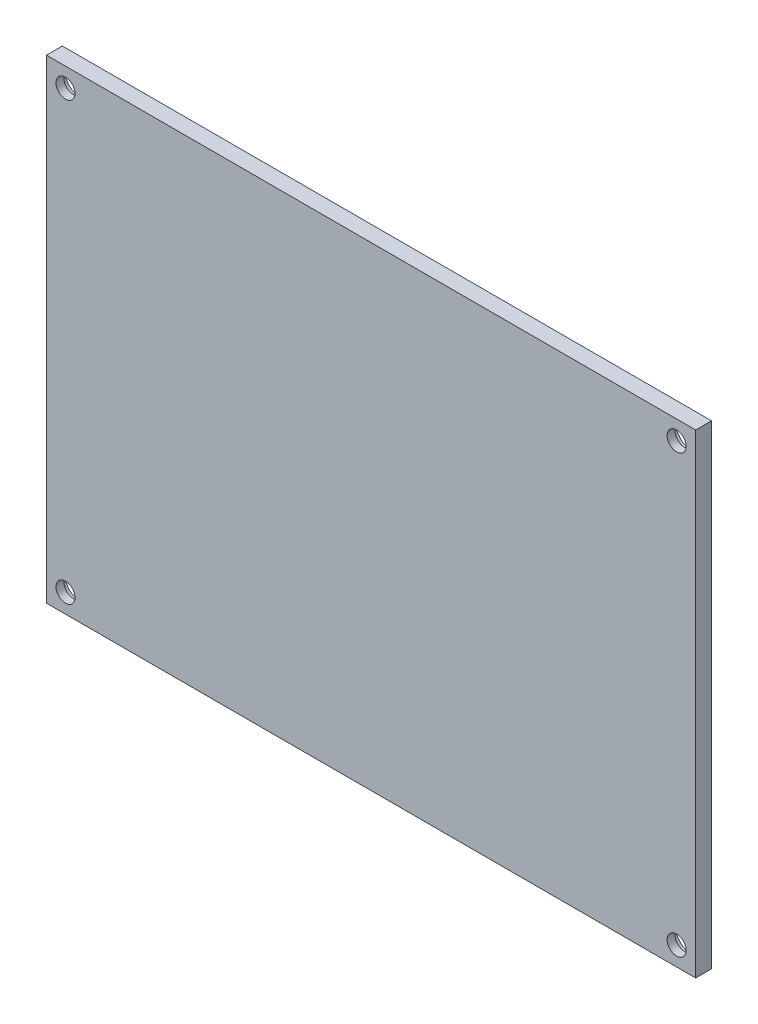
ISO-10303-21;
HEADER;
FILE_DESCRIPTION(('STEP AP214'),'2;1');
FILE_NAME('part.step','',(''),(''),'','','');
FILE_SCHEMA(('AUTOMOTIVE_DESIGN { 1 0 10303 214 1 1 1 1 }'));
ENDSEC;
DATA;
#1=APPLICATION_CONTEXT('core data for automotive mechanical design processes');
#2=APPLICATION_PROTOCOL_DEFINITION('international standard','automotive_design',2000,#1);
#3=PRODUCT_CONTEXT('',#1,'mechanical');
#4=PRODUCT('Part','Part','',(#3));
#5=PRODUCT_RELATED_PRODUCT_CATEGORY('part','',(#4));
#6=PRODUCT_DEFINITION_FORMATION('','',#4);
#7=PRODUCT_DEFINITION_CONTEXT('part definition',#1,'design');
#8=PRODUCT_DEFINITION('design','',#6,#7);
#9=PRODUCT_DEFINITION_SHAPE('','',#8);
#10=(LENGTH_UNIT() NAMED_UNIT(*) SI_UNIT(.MILLI.,.METRE.));
#11=(NAMED_UNIT(*) PLANE_ANGLE_UNIT() SI_UNIT($,.RADIAN.));
#12=(NAMED_UNIT(*) SI_UNIT($,.STERADIAN.) SOLID_ANGLE_UNIT());
#13=UNCERTAINTY_MEASURE_WITH_UNIT(LENGTH_MEASURE(1.E-05),#10,'distance_accuracy_value','');
#14=(GEOMETRIC_REPRESENTATION_CONTEXT(3) GLOBAL_UNCERTAINTY_ASSIGNED_CONTEXT((#13)) GLOBAL_UNIT_ASSIGNED_CONTEXT((#10,
#11,#12)) REPRESENTATION_CONTEXT('',''));
#15=CARTESIAN_POINT('',(0.,0.,0.));
#16=DIRECTION('',(0.,0.,1.));
#17=DIRECTION('',(1.,0.,0.));
#18=AXIS2_PLACEMENT_3D('',#15,#16,#17);
#19=CARTESIAN_POINT('',(54.6911532185415,-26.7638727859662,2.));
#20=DIRECTION('',(0.,1.,0.));
#21=DIRECTION('',(0.,0.,1.));
#22=AXIS2_PLACEMENT_3D('',#19,#20,#21);
#23=PLANE('',#22);
#24=DIRECTION('',(1.,0.,0.));
#25=VECTOR('',#24,1.);
#26=CARTESIAN_POINT('',(54.6911532185415,-26.7638727859662,0.));
#27=LINE('',#26,#25);
#28=CARTESIAN_POINT('',(54.6911532185415,-26.7638727859662,0.));
#29=VERTEX_POINT('',#28);
#30=CARTESIAN_POINT('',(136.491153218541,-26.7638727859662,0.));
#31=VERTEX_POINT('',#30);
#32=EDGE_CURVE('E99',#29,#31,#27,.T.);
#33=ORIENTED_EDGE('',*,*,#32,.T.);
#34=DIRECTION('',(0.,0.,-1.));
#35=VECTOR('',#34,1.);
#36=CARTESIAN_POINT('',(136.491153218541,-26.7638727859662,2.));
#37=LINE('',#36,#35);
#38=CARTESIAN_POINT('',(136.491153218541,-26.7638727859662,2.));
#39=VERTEX_POINT('',#38);
#40=EDGE_CURVE('E11',#39,#31,#37,.T.);
#41=ORIENTED_EDGE('',*,*,#40,.F.);
#42=DIRECTION('',(1.,0.,0.));
#43=VECTOR('',#42,1.);
#44=CARTESIAN_POINT('',(54.6911532185415,-26.7638727859662,2.));
#45=LINE('',#44,#43);
#46=CARTESIAN_POINT('',(54.6911532185415,-26.7638727859662,2.));
#47=VERTEX_POINT('',#46);
#48=EDGE_CURVE('E86',#47,#39,#45,.T.);
#49=ORIENTED_EDGE('',*,*,#48,.F.);
#50=DIRECTION('',(0.,0.,-1.));
#51=VECTOR('',#50,1.);
#52=CARTESIAN_POINT('',(54.6911532185415,-26.7638727859662,2.));
#53=LINE('',#52,#51);
#54=EDGE_CURVE('E95',#47,#29,#53,.T.);
#55=ORIENTED_EDGE('',*,*,#54,.T.);
#56=EDGE_LOOP('',(#33,#41,#49,#55));
#57=FACE_BOUND('',#56,.T.);
#58=ADVANCED_FACE('F33',(#57),#23,.F.);
#59=CARTESIAN_POINT('',(136.491153218541,-26.7638727859662,2.));
#60=DIRECTION('',(-1.,0.,0.));
#61=DIRECTION('',(0.,0.,1.));
#62=AXIS2_PLACEMENT_3D('',#59,#60,#61);
#63=PLANE('',#62);
#64=DIRECTION('',(0.,1.,0.));
#65=VECTOR('',#64,1.);
#66=CARTESIAN_POINT('',(136.491153218541,-26.7638727859662,0.));
#67=LINE('',#66,#65);
#68=CARTESIAN_POINT('',(136.491153218541,33.0361272140338,0.));
#69=VERTEX_POINT('',#68);
#70=EDGE_CURVE('E90',#31,#69,#67,.T.);
#71=ORIENTED_EDGE('',*,*,#70,.T.);
#72=DIRECTION('',(0.,0.,-1.));
#73=VECTOR('',#72,1.);
#74=CARTESIAN_POINT('',(136.491153218541,33.0361272140338,2.));
#75=LINE('',#74,#73);
#76=CARTESIAN_POINT('',(136.491153218541,33.0361272140338,2.));
#77=VERTEX_POINT('',#76);
#78=EDGE_CURVE('E42',#77,#69,#75,.T.);
#79=ORIENTED_EDGE('',*,*,#78,.F.);
#80=DIRECTION('',(0.,1.,0.));
#81=VECTOR('',#80,1.);
#82=CARTESIAN_POINT('',(136.491153218541,-26.7638727859662,2.));
#83=LINE('',#82,#81);
#84=EDGE_CURVE('E81',#39,#77,#83,.T.);
#85=ORIENTED_EDGE('',*,*,#84,.F.);
#86=ORIENTED_EDGE('',*,*,#40,.T.);
#87=EDGE_LOOP('',(#71,#79,#85,#86));
#88=FACE_BOUND('',#87,.T.);
#89=ADVANCED_FACE('F89',(#88),#63,.F.);
#90=CARTESIAN_POINT('',(136.491153218541,33.0361272140338,2.));
#91=DIRECTION('',(0.,-1.,0.));
#92=DIRECTION('',(0.,0.,-1.));
#93=AXIS2_PLACEMENT_3D('',#90,#91,#92);
#94=PLANE('',#93);
#95=DIRECTION('',(-1.,0.,0.));
#96=VECTOR('',#95,1.);
#97=CARTESIAN_POINT('',(136.491153218541,33.0361272140338,0.));
#98=LINE('',#97,#96);
#99=CARTESIAN_POINT('',(54.6911532185415,33.0361272140338,0.));
#100=VERTEX_POINT('',#99);
#101=EDGE_CURVE('E68',#69,#100,#98,.T.);
#102=ORIENTED_EDGE('',*,*,#101,.T.);
#103=DIRECTION('',(0.,0.,-1.));
#104=VECTOR('',#103,1.);
#105=CARTESIAN_POINT('',(54.6911532185415,33.0361272140338,2.));
#106=LINE('',#105,#104);
#107=CARTESIAN_POINT('',(54.6911532185415,33.0361272140338,2.));
#108=VERTEX_POINT('',#107);
#109=EDGE_CURVE('E91',#108,#100,#106,.T.);
#110=ORIENTED_EDGE('',*,*,#109,.F.);
#111=DIRECTION('',(-1.,0.,0.));
#112=VECTOR('',#111,1.);
#113=CARTESIAN_POINT('',(136.491153218541,33.0361272140338,2.));
#114=LINE('',#113,#112);
#115=EDGE_CURVE('E84',#77,#108,#114,.T.);
#116=ORIENTED_EDGE('',*,*,#115,.F.);
#117=ORIENTED_EDGE('',*,*,#78,.T.);
#118=EDGE_LOOP('',(#102,#110,#116,#117));
#119=FACE_BOUND('',#118,.T.);
#120=ADVANCED_FACE('F93',(#119),#94,.F.);
#121=CARTESIAN_POINT('',(54.6911532185415,33.0361272140338,2.));
#122=DIRECTION('',(1.,0.,0.));
#123=DIRECTION('',(0.,1.,0.));
#124=AXIS2_PLACEMENT_3D('',#121,#122,#123);
#125=PLANE('',#124);
#126=DIRECTION('',(0.,-1.,0.));
#127=VECTOR('',#126,1.);
#128=CARTESIAN_POINT('',(54.6911532185415,33.0361272140338,0.));
#129=LINE('',#128,#127);
#130=EDGE_CURVE('E74',#100,#29,#129,.T.);
#131=ORIENTED_EDGE('',*,*,#130,.T.);
#132=ORIENTED_EDGE('',*,*,#54,.F.);
#133=DIRECTION('',(0.,-1.,0.));
#134=VECTOR('',#133,1.);
#135=CARTESIAN_POINT('',(54.6911532185415,33.0361272140338,2.));
#136=LINE('',#135,#134);
#137=EDGE_CURVE('E51',#108,#47,#136,.T.);
#138=ORIENTED_EDGE('',*,*,#137,.F.);
#139=ORIENTED_EDGE('',*,*,#109,.T.);
#140=EDGE_LOOP('',(#131,#132,#138,#139));
#141=FACE_BOUND('',#140,.T.);
#142=ADVANCED_FACE('F168',(#141),#125,.F.);
#143=CARTESIAN_POINT('',(0.,0.,2.));
#144=DIRECTION('',(0.,0.,1.));
#145=DIRECTION('',(1.,0.,0.));
#146=AXIS2_PLACEMENT_3D('',#143,#144,#145);
#147=PLANE('',#146);
#148=CARTESIAN_POINT('',(57.0911532185415,30.6361272140338,2.));
#149=DIRECTION('',(0.,0.,1.));
#150=DIRECTION('',(1.,0.,0.));
#151=AXIS2_PLACEMENT_3D('',#148,#149,#150);
#152=CIRCLE('',#151,1.2);
#153=CARTESIAN_POINT('',(58.2911532185415,30.6361272140338,2.));
#154=VERTEX_POINT('',#153);
#155=EDGE_CURVE('E36',#154,#154,#152,.T.);
#156=ORIENTED_EDGE('',*,*,#155,.F.);
#157=EDGE_LOOP('',(#156));
#158=FACE_BOUND('',#157,.T.);
#159=CARTESIAN_POINT('',(134.091153218541,30.6361272140338,2.));
#160=DIRECTION('',(0.,0.,1.));
#161=DIRECTION('',(1.,0.,0.));
#162=AXIS2_PLACEMENT_3D('',#159,#160,#161);
#163=CIRCLE('',#162,1.20000000000001);
#164=CARTESIAN_POINT('',(135.291153218541,30.6361272140338,2.));
#165=VERTEX_POINT('',#164);
#166=EDGE_CURVE('E115',#165,#165,#163,.T.);
#167=ORIENTED_EDGE('',*,*,#166,.F.);
#168=EDGE_LOOP('',(#167));
#169=FACE_BOUND('',#168,.T.);
#170=CARTESIAN_POINT('',(57.0911532185415,-24.3638727859662,2.));
#171=DIRECTION('',(0.,0.,1.));
#172=DIRECTION('',(1.,0.,0.));
#173=AXIS2_PLACEMENT_3D('',#170,#171,#172);
#174=CIRCLE('',#173,1.2);
#175=CARTESIAN_POINT('',(58.2911532185415,-24.3638727859662,2.));
#176=VERTEX_POINT('',#175);
#177=EDGE_CURVE('E111',#176,#176,#174,.T.);
#178=ORIENTED_EDGE('',*,*,#177,.F.);
#179=EDGE_LOOP('',(#178));
#180=FACE_BOUND('',#179,.T.);
#181=CARTESIAN_POINT('',(134.091153218541,-24.3638727859662,2.));
#182=DIRECTION('',(0.,0.,1.));
#183=DIRECTION('',(1.,0.,0.));
#184=AXIS2_PLACEMENT_3D('',#181,#182,#183);
#185=CIRCLE('',#184,1.20000000000001);
#186=CARTESIAN_POINT('',(135.291153218541,-24.3638727859662,2.));
#187=VERTEX_POINT('',#186);
#188=EDGE_CURVE('E102',#187,#187,#185,.T.);
#189=ORIENTED_EDGE('',*,*,#188,.F.);
#190=EDGE_LOOP('',(#189));
#191=FACE_BOUND('',#190,.T.);
#192=ORIENTED_EDGE('',*,*,#48,.T.);
#193=ORIENTED_EDGE('',*,*,#84,.T.);
#194=ORIENTED_EDGE('',*,*,#115,.T.);
#195=ORIENTED_EDGE('',*,*,#137,.T.);
#196=EDGE_LOOP('',(#192,#193,#194,#195));
#197=FACE_BOUND('',#196,.T.);
#198=ADVANCED_FACE('F82',(#158,#169,#180,#191,#197),#147,.T.);
#199=CARTESIAN_POINT('',(0.,0.,0.));
#200=DIRECTION('',(0.,0.,1.));
#201=DIRECTION('',(1.,0.,0.));
#202=AXIS2_PLACEMENT_3D('',#199,#200,#201);
#203=PLANE('',#202);
#204=CARTESIAN_POINT('',(57.0911532185415,30.6361272140338,0.));
#205=DIRECTION('',(0.,0.,-1.));
#206=DIRECTION('',(-1.,0.,0.));
#207=AXIS2_PLACEMENT_3D('',#204,#205,#206);
#208=CIRCLE('',#207,2.125);
#209=CARTESIAN_POINT('',(54.9661532185415,30.6361272140338,0.));
#210=VERTEX_POINT('',#209);
#211=EDGE_CURVE('E323',#210,#210,#208,.T.);
#212=ORIENTED_EDGE('',*,*,#211,.F.);
#213=EDGE_LOOP('',(#212));
#214=FACE_BOUND('',#213,.T.);
#215=CARTESIAN_POINT('',(134.091153218541,30.6361272140338,0.));
#216=DIRECTION('',(0.,0.,-1.));
#217=DIRECTION('',(-1.,0.,0.));
#218=AXIS2_PLACEMENT_3D('',#215,#216,#217);
#219=CIRCLE('',#218,2.12499999999999);
#220=CARTESIAN_POINT('',(131.966153218541,30.6361272140338,0.));
#221=VERTEX_POINT('',#220);
#222=EDGE_CURVE('E130',#221,#221,#219,.T.);
#223=ORIENTED_EDGE('',*,*,#222,.F.);
#224=EDGE_LOOP('',(#223));
#225=FACE_BOUND('',#224,.T.);
#226=CARTESIAN_POINT('',(57.0911532185415,-24.3638727859662,0.));
#227=DIRECTION('',(0.,0.,-1.));
#228=DIRECTION('',(-1.,0.,0.));
#229=AXIS2_PLACEMENT_3D('',#226,#227,#228);
#230=CIRCLE('',#229,2.125);
#231=CARTESIAN_POINT('',(54.9661532185415,-24.3638727859662,0.));
#232=VERTEX_POINT('',#231);
#233=EDGE_CURVE('E117',#232,#232,#230,.T.);
#234=ORIENTED_EDGE('',*,*,#233,.F.);
#235=EDGE_LOOP('',(#234));
#236=FACE_BOUND('',#235,.T.);
#237=CARTESIAN_POINT('',(134.091153218541,-24.3638727859662,0.));
#238=DIRECTION('',(0.,0.,-1.));
#239=DIRECTION('',(-1.,0.,0.));
#240=AXIS2_PLACEMENT_3D('',#237,#238,#239);
#241=CIRCLE('',#240,2.12499999999999);
#242=CARTESIAN_POINT('',(131.966153218541,-24.3638727859662,0.));
#243=VERTEX_POINT('',#242);
#244=EDGE_CURVE('E113',#243,#243,#241,.T.);
#245=ORIENTED_EDGE('',*,*,#244,.F.);
#246=EDGE_LOOP('',(#245));
#247=FACE_BOUND('',#246,.T.);
#248=ORIENTED_EDGE('',*,*,#32,.F.);
#249=ORIENTED_EDGE('',*,*,#130,.F.);
#250=ORIENTED_EDGE('',*,*,#101,.F.);
#251=ORIENTED_EDGE('',*,*,#70,.F.);
#252=EDGE_LOOP('',(#248,#249,#250,#251));
#253=FACE_BOUND('',#252,.T.);
#254=ADVANCED_FACE('F161',(#214,#225,#236,#247,#253),#203,.F.);
#255=CARTESIAN_POINT('',(134.091153218541,-24.3638727859662,0.));
#256=DIRECTION('',(0.,0.,-1.));
#257=DIRECTION('',(-1.,0.,0.));
#258=AXIS2_PLACEMENT_3D('',#255,#256,#257);
#259=CYLINDRICAL_SURFACE('',#258,1.20000000000001);
#260=ORIENTED_EDGE('',*,*,#188,.T.);
#261=EDGE_LOOP('',(#260));
#262=FACE_BOUND('',#261,.T.);
#263=CARTESIAN_POINT('',(134.091153218541,-24.3638727859662,1.));
#264=DIRECTION('',(0.,0.,-1.));
#265=DIRECTION('',(-1.,0.,0.));
#266=AXIS2_PLACEMENT_3D('',#263,#264,#265);
#267=CIRCLE('',#266,1.20000000000001);
#268=CARTESIAN_POINT('',(132.891153218541,-24.3638727859662,1.));
#269=VERTEX_POINT('',#268);
#270=EDGE_CURVE('E110',#269,#269,#267,.T.);
#271=ORIENTED_EDGE('',*,*,#270,.T.);
#272=EDGE_LOOP('',(#271));
#273=FACE_BOUND('',#272,.T.);
#274=ADVANCED_FACE('F146',(#262,#273),#259,.F.);
#275=CARTESIAN_POINT('',(135.291153218541,-24.3638727859662,1.));
#276=DIRECTION('',(0.,0.,1.));
#277=DIRECTION('',(1.,0.,0.));
#278=AXIS2_PLACEMENT_3D('',#275,#276,#277);
#279=PLANE('',#278);
#280=ORIENTED_EDGE('',*,*,#270,.F.);
#281=EDGE_LOOP('',(#280));
#282=FACE_BOUND('',#281,.T.);
#283=CARTESIAN_POINT('',(134.091153218541,-24.3638727859662,1.));
#284=DIRECTION('',(0.,0.,-1.));
#285=DIRECTION('',(-1.,0.,0.));
#286=AXIS2_PLACEMENT_3D('',#283,#284,#285);
#287=CIRCLE('',#286,2.12499999999999);
#288=CARTESIAN_POINT('',(131.966153218541,-24.3638727859662,1.));
#289=VERTEX_POINT('',#288);
#290=EDGE_CURVE('E140',#289,#289,#287,.T.);
#291=ORIENTED_EDGE('',*,*,#290,.T.);
#292=EDGE_LOOP('',(#291));
#293=FACE_BOUND('',#292,.T.);
#294=ADVANCED_FACE('F148',(#282,#293),#279,.F.);
#295=CARTESIAN_POINT('',(134.091153218541,-24.3638727859662,0.));
#296=DIRECTION('',(0.,0.,-1.));
#297=DIRECTION('',(-1.,0.,0.));
#298=AXIS2_PLACEMENT_3D('',#295,#296,#297);
#299=CYLINDRICAL_SURFACE('',#298,2.12499999999999);
#300=ORIENTED_EDGE('',*,*,#290,.F.);
#301=EDGE_LOOP('',(#300));
#302=FACE_BOUND('',#301,.T.);
#303=ORIENTED_EDGE('',*,*,#244,.T.);
#304=EDGE_LOOP('',(#303));
#305=FACE_BOUND('',#304,.T.);
#306=ADVANCED_FACE('F151',(#302,#305),#299,.F.);
#307=CARTESIAN_POINT('',(57.0911532185415,-24.3638727859662,0.));
#308=DIRECTION('',(0.,0.,-1.));
#309=DIRECTION('',(-1.,0.,0.));
#310=AXIS2_PLACEMENT_3D('',#307,#308,#309);
#311=CYLINDRICAL_SURFACE('',#310,1.2);
#312=ORIENTED_EDGE('',*,*,#177,.T.);
#313=EDGE_LOOP('',(#312));
#314=FACE_BOUND('',#313,.T.);
#315=CARTESIAN_POINT('',(57.0911532185415,-24.3638727859662,1.));
#316=DIRECTION('',(0.,0.,-1.));
#317=DIRECTION('',(-1.,0.,0.));
#318=AXIS2_PLACEMENT_3D('',#315,#316,#317);
#319=CIRCLE('',#318,1.2);
#320=CARTESIAN_POINT('',(55.8911532185415,-24.3638727859662,1.));
#321=VERTEX_POINT('',#320);
#322=EDGE_CURVE('E114',#321,#321,#319,.T.);
#323=ORIENTED_EDGE('',*,*,#322,.T.);
#324=EDGE_LOOP('',(#323));
#325=FACE_BOUND('',#324,.T.);
#326=ADVANCED_FACE('F157',(#314,#325),#311,.F.);
#327=CARTESIAN_POINT('',(58.2911532185415,-24.3638727859662,1.));
#328=DIRECTION('',(0.,0.,1.));
#329=DIRECTION('',(1.,0.,0.));
#330=AXIS2_PLACEMENT_3D('',#327,#328,#329);
#331=PLANE('',#330);
#332=ORIENTED_EDGE('',*,*,#322,.F.);
#333=EDGE_LOOP('',(#332));
#334=FACE_BOUND('',#333,.T.);
#335=CARTESIAN_POINT('',(57.0911532185415,-24.3638727859662,1.));
#336=DIRECTION('',(0.,0.,-1.));
#337=DIRECTION('',(-1.,0.,0.));
#338=AXIS2_PLACEMENT_3D('',#335,#336,#337);
#339=CIRCLE('',#338,2.125);
#340=CARTESIAN_POINT('',(54.9661532185415,-24.3638727859662,1.));
#341=VERTEX_POINT('',#340);
#342=EDGE_CURVE('E122',#341,#341,#339,.T.);
#343=ORIENTED_EDGE('',*,*,#342,.T.);
#344=EDGE_LOOP('',(#343));
#345=FACE_BOUND('',#344,.T.);
#346=ADVANCED_FACE('F234',(#334,#345),#331,.F.);
#347=CARTESIAN_POINT('',(57.0911532185415,-24.3638727859662,0.));
#348=DIRECTION('',(0.,0.,-1.));
#349=DIRECTION('',(-1.,0.,0.));
#350=AXIS2_PLACEMENT_3D('',#347,#348,#349);
#351=CYLINDRICAL_SURFACE('',#350,2.125);
#352=ORIENTED_EDGE('',*,*,#342,.F.);
#353=EDGE_LOOP('',(#352));
#354=FACE_BOUND('',#353,.T.);
#355=ORIENTED_EDGE('',*,*,#233,.T.);
#356=EDGE_LOOP('',(#355));
#357=FACE_BOUND('',#356,.T.);
#358=ADVANCED_FACE('F244',(#354,#357),#351,.F.);
#359=CARTESIAN_POINT('',(134.091153218541,30.6361272140338,0.));
#360=DIRECTION('',(0.,0.,-1.));
#361=DIRECTION('',(-1.,0.,0.));
#362=AXIS2_PLACEMENT_3D('',#359,#360,#361);
#363=CYLINDRICAL_SURFACE('',#362,1.20000000000001);
#364=ORIENTED_EDGE('',*,*,#166,.T.);
#365=EDGE_LOOP('',(#364));
#366=FACE_BOUND('',#365,.T.);
#367=CARTESIAN_POINT('',(134.091153218541,30.6361272140338,1.));
#368=DIRECTION('',(0.,0.,-1.));
#369=DIRECTION('',(-1.,0.,0.));
#370=AXIS2_PLACEMENT_3D('',#367,#368,#369);
#371=CIRCLE('',#370,1.20000000000001);
#372=CARTESIAN_POINT('',(132.891153218541,30.6361272140338,1.));
#373=VERTEX_POINT('',#372);
#374=EDGE_CURVE('E118',#373,#373,#371,.T.);
#375=ORIENTED_EDGE('',*,*,#374,.T.);
#376=EDGE_LOOP('',(#375));
#377=FACE_BOUND('',#376,.T.);
#378=ADVANCED_FACE('F254',(#366,#377),#363,.F.);
#379=CARTESIAN_POINT('',(135.291153218541,30.6361272140338,1.));
#380=DIRECTION('',(0.,0.,1.));
#381=DIRECTION('',(1.,0.,0.));
#382=AXIS2_PLACEMENT_3D('',#379,#380,#381);
#383=PLANE('',#382);
#384=ORIENTED_EDGE('',*,*,#374,.F.);
#385=EDGE_LOOP('',(#384));
#386=FACE_BOUND('',#385,.T.);
#387=CARTESIAN_POINT('',(134.091153218541,30.6361272140338,1.));
#388=DIRECTION('',(0.,0.,-1.));
#389=DIRECTION('',(-1.,0.,0.));
#390=AXIS2_PLACEMENT_3D('',#387,#388,#389);
#391=CIRCLE('',#390,2.12499999999999);
#392=CARTESIAN_POINT('',(131.966153218541,30.6361272140338,1.));
#393=VERTEX_POINT('',#392);
#394=EDGE_CURVE('E125',#393,#393,#391,.T.);
#395=ORIENTED_EDGE('',*,*,#394,.T.);
#396=EDGE_LOOP('',(#395));
#397=FACE_BOUND('',#396,.T.);
#398=ADVANCED_FACE('F264',(#386,#397),#383,.F.);
#399=CARTESIAN_POINT('',(134.091153218541,30.6361272140338,0.));
#400=DIRECTION('',(0.,0.,-1.));
#401=DIRECTION('',(-1.,0.,0.));
#402=AXIS2_PLACEMENT_3D('',#399,#400,#401);
#403=CYLINDRICAL_SURFACE('',#402,2.12499999999999);
#404=ORIENTED_EDGE('',*,*,#394,.F.);
#405=EDGE_LOOP('',(#404));
#406=FACE_BOUND('',#405,.T.);
#407=ORIENTED_EDGE('',*,*,#222,.T.);
#408=EDGE_LOOP('',(#407));
#409=FACE_BOUND('',#408,.T.);
#410=ADVANCED_FACE('F273',(#406,#409),#403,.F.);
#411=CARTESIAN_POINT('',(57.0911532185415,30.6361272140338,0.));
#412=DIRECTION('',(0.,0.,-1.));
#413=DIRECTION('',(-1.,0.,0.));
#414=AXIS2_PLACEMENT_3D('',#411,#412,#413);
#415=CYLINDRICAL_SURFACE('',#414,1.2);
#416=ORIENTED_EDGE('',*,*,#155,.T.);
#417=EDGE_LOOP('',(#416));
#418=FACE_BOUND('',#417,.T.);
#419=CARTESIAN_POINT('',(57.0911532185415,30.6361272140338,1.));
#420=DIRECTION('',(0.,0.,-1.));
#421=DIRECTION('',(-1.,0.,0.));
#422=AXIS2_PLACEMENT_3D('',#419,#420,#421);
#423=CIRCLE('',#422,1.2);
#424=CARTESIAN_POINT('',(55.8911532185415,30.6361272140338,1.));
#425=VERTEX_POINT('',#424);
#426=EDGE_CURVE('E325',#425,#425,#423,.T.);
#427=ORIENTED_EDGE('',*,*,#426,.T.);
#428=EDGE_LOOP('',(#427));
#429=FACE_BOUND('',#428,.T.);
#430=ADVANCED_FACE('F283',(#418,#429),#415,.F.);
#431=CARTESIAN_POINT('',(58.2911532185415,30.6361272140338,1.));
#432=DIRECTION('',(0.,0.,1.));
#433=DIRECTION('',(1.,0.,0.));
#434=AXIS2_PLACEMENT_3D('',#431,#432,#433);
#435=PLANE('',#434);
#436=ORIENTED_EDGE('',*,*,#426,.F.);
#437=EDGE_LOOP('',(#436));
#438=FACE_BOUND('',#437,.T.);
#439=CARTESIAN_POINT('',(57.0911532185415,30.6361272140338,1.));
#440=DIRECTION('',(0.,0.,-1.));
#441=DIRECTION('',(-1.,0.,0.));
#442=AXIS2_PLACEMENT_3D('',#439,#440,#441);
#443=CIRCLE('',#442,2.125);
#444=CARTESIAN_POINT('',(54.9661532185415,30.6361272140338,1.));
#445=VERTEX_POINT('',#444);
#446=EDGE_CURVE('E320',#445,#445,#443,.T.);
#447=ORIENTED_EDGE('',*,*,#446,.T.);
#448=EDGE_LOOP('',(#447));
#449=FACE_BOUND('',#448,.T.);
#450=ADVANCED_FACE('F293',(#438,#449),#435,.F.);
#451=CARTESIAN_POINT('',(57.0911532185415,30.6361272140338,0.));
#452=DIRECTION('',(0.,0.,-1.));
#453=DIRECTION('',(-1.,0.,0.));
#454=AXIS2_PLACEMENT_3D('',#451,#452,#453);
#455=CYLINDRICAL_SURFACE('',#454,2.125);
#456=ORIENTED_EDGE('',*,*,#446,.F.);
#457=EDGE_LOOP('',(#456));
#458=FACE_BOUND('',#457,.T.);
#459=ORIENTED_EDGE('',*,*,#211,.T.);
#460=EDGE_LOOP('',(#459));
#461=FACE_BOUND('',#460,.T.);
#462=ADVANCED_FACE('F303',(#458,#461),#455,.F.);
#463=CLOSED_SHELL('',(#58,#89,#120,#142,#198,#254,#274,#294,#306,#326,#346,#358,#378,#398,#410,
#430,#450,#462));
#464=MANIFOLD_SOLID_BREP('B2',#463);
#465=ADVANCED_BREP_SHAPE_REPRESENTATION('',(#18,#464),#14);
#466=SHAPE_DEFINITION_REPRESENTATION(#9,#465);
ENDSEC;
END-ISO-10303-21;
